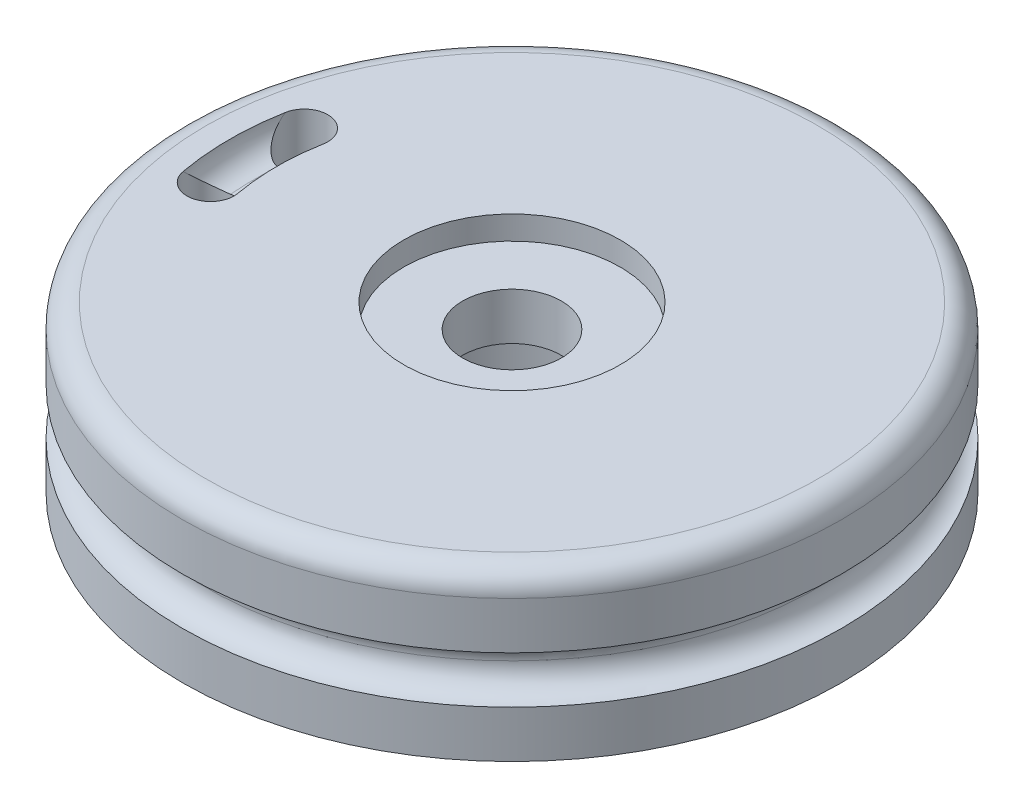
ISO-10303-21;
HEADER;
FILE_DESCRIPTION(('STEP AP214'),'2;1');
FILE_NAME('part.step','',(''),(''),'','','');
FILE_SCHEMA(('AUTOMOTIVE_DESIGN { 1 0 10303 214 1 1 1 1 }'));
ENDSEC;
DATA;
#1=APPLICATION_CONTEXT('core data for automotive mechanical design processes');
#2=APPLICATION_PROTOCOL_DEFINITION('international standard','automotive_design',2000,#1);
#3=PRODUCT_CONTEXT('',#1,'mechanical');
#4=PRODUCT('Part','Part','',(#3));
#5=PRODUCT_RELATED_PRODUCT_CATEGORY('part','',(#4));
#6=PRODUCT_DEFINITION_FORMATION('','',#4);
#7=PRODUCT_DEFINITION_CONTEXT('part definition',#1,'design');
#8=PRODUCT_DEFINITION('design','',#6,#7);
#9=PRODUCT_DEFINITION_SHAPE('','',#8);
#10=(LENGTH_UNIT() NAMED_UNIT(*) SI_UNIT(.MILLI.,.METRE.));
#11=(NAMED_UNIT(*) PLANE_ANGLE_UNIT() SI_UNIT($,.RADIAN.));
#12=(NAMED_UNIT(*) SI_UNIT($,.STERADIAN.) SOLID_ANGLE_UNIT());
#13=UNCERTAINTY_MEASURE_WITH_UNIT(LENGTH_MEASURE(1.E-05),#10,'distance_accuracy_value','');
#14=(GEOMETRIC_REPRESENTATION_CONTEXT(3) GLOBAL_UNCERTAINTY_ASSIGNED_CONTEXT((#13)) GLOBAL_UNIT_ASSIGNED_CONTEXT((#10,
#11,#12)) REPRESENTATION_CONTEXT('',''));
#15=CARTESIAN_POINT('',(0.,0.,0.));
#16=DIRECTION('',(0.,0.,1.));
#17=DIRECTION('',(1.,0.,0.));
#18=AXIS2_PLACEMENT_3D('',#15,#16,#17);
#19=CARTESIAN_POINT('',(0.,3.5,0.));
#20=DIRECTION('',(0.,1.,0.));
#21=DIRECTION('',(-1.,0.,0.));
#22=AXIS2_PLACEMENT_3D('',#19,#20,#21);
#23=PLANE('',#22);
#24=CARTESIAN_POINT('',(0.,3.5,0.));
#25=DIRECTION('',(0.,1.,0.));
#26=DIRECTION('',(-1.,0.,0.));
#27=AXIS2_PLACEMENT_3D('',#24,#25,#26);
#28=CIRCLE('',#27,2.30000000000001);
#29=CARTESIAN_POINT('',(-2.30000000000001,3.5,0.));
#30=VERTEX_POINT('',#29);
#31=EDGE_CURVE('E477',#30,#30,#28,.T.);
#32=ORIENTED_EDGE('',*,*,#31,.F.);
#33=EDGE_LOOP('',(#32));
#34=FACE_BOUND('',#33,.T.);
#35=CARTESIAN_POINT('',(0.,3.5,0.));
#36=DIRECTION('',(0.,1.,0.));
#37=DIRECTION('',(-1.,0.,0.));
#38=AXIS2_PLACEMENT_3D('',#35,#36,#37);
#39=CIRCLE('',#38,6.5);
#40=CARTESIAN_POINT('',(-6.5,3.5,0.));
#41=VERTEX_POINT('',#40);
#42=EDGE_CURVE('E473',#41,#41,#39,.T.);
#43=ORIENTED_EDGE('',*,*,#42,.T.);
#44=EDGE_LOOP('',(#43));
#45=FACE_BOUND('',#44,.T.);
#46=CARTESIAN_POINT('',(-5.40909090909091,3.5,0.995859195463939));
#47=DIRECTION('',(0.,1.,0.));
#48=DIRECTION('',(1.,0.,0.));
#49=AXIS2_PLACEMENT_3D('',#46,#47,#48);
#50=CIRCLE('',#49,0.5);
#51=CARTESIAN_POINT('',(-5.90082644628099,3.5,1.08639184959702));
#52=VERTEX_POINT('',#51);
#53=CARTESIAN_POINT('',(-4.91735537190083,3.5,0.905326541330852));
#54=VERTEX_POINT('',#53);
#55=EDGE_CURVE('E463',#52,#54,#50,.T.);
#56=ORIENTED_EDGE('',*,*,#55,.F.);
#57=CARTESIAN_POINT('',(0.,3.5,0.));
#58=DIRECTION('',(0.,1.,0.));
#59=DIRECTION('',(-1.,0.,0.));
#60=AXIS2_PLACEMENT_3D('',#57,#58,#59);
#61=CIRCLE('',#60,6.);
#62=CARTESIAN_POINT('',(-5.90082644628099,3.5,-1.08639184959702));
#63=VERTEX_POINT('',#62);
#64=EDGE_CURVE('E467',#63,#52,#61,.T.);
#65=ORIENTED_EDGE('',*,*,#64,.F.);
#66=CARTESIAN_POINT('',(-5.40909090909091,3.5,-0.995859195463939));
#67=DIRECTION('',(0.,1.,0.));
#68=DIRECTION('',(-1.,0.,0.));
#69=AXIS2_PLACEMENT_3D('',#66,#67,#68);
#70=CIRCLE('',#69,0.5);
#71=CARTESIAN_POINT('',(-4.91735537190083,3.5,-0.905326541330853));
#72=VERTEX_POINT('',#71);
#73=EDGE_CURVE('E454',#72,#63,#70,.T.);
#74=ORIENTED_EDGE('',*,*,#73,.F.);
#75=CARTESIAN_POINT('',(0.,3.5,0.));
#76=DIRECTION('',(0.,-1.,0.));
#77=DIRECTION('',(-1.,0.,0.));
#78=AXIS2_PLACEMENT_3D('',#75,#76,#77);
#79=CIRCLE('',#78,5.);
#80=EDGE_CURVE('E460',#54,#72,#79,.T.);
#81=ORIENTED_EDGE('',*,*,#80,.F.);
#82=EDGE_LOOP('',(#56,#65,#74,#81));
#83=FACE_BOUND('',#82,.T.);
#84=ADVANCED_FACE('F47',(#34,#45,#83),#23,.T.);
#85=CARTESIAN_POINT('',(0.,3.,0.));
#86=DIRECTION('',(0.,1.,0.));
#87=DIRECTION('',(-1.,0.,0.));
#88=AXIS2_PLACEMENT_3D('',#85,#86,#87);
#89=TOROIDAL_SURFACE('',#88,6.5,0.5);
#90=ORIENTED_EDGE('',*,*,#42,.F.);
#91=EDGE_LOOP('',(#90));
#92=FACE_BOUND('',#91,.T.);
#93=CARTESIAN_POINT('',(0.,3.,0.));
#94=DIRECTION('',(0.,1.,0.));
#95=DIRECTION('',(-1.,0.,0.));
#96=AXIS2_PLACEMENT_3D('',#93,#94,#95);
#97=CIRCLE('',#96,7.);
#98=CARTESIAN_POINT('',(-7.,3.,0.));
#99=VERTEX_POINT('',#98);
#100=EDGE_CURVE('E347',#99,#99,#97,.T.);
#101=ORIENTED_EDGE('',*,*,#100,.T.);
#102=EDGE_LOOP('',(#101));
#103=FACE_BOUND('',#102,.T.);
#104=ADVANCED_FACE('F296',(#92,#103),#89,.T.);
#105=CARTESIAN_POINT('',(0.,3.5,0.));
#106=DIRECTION('',(0.,1.,0.));
#107=DIRECTION('',(-1.,0.,0.));
#108=AXIS2_PLACEMENT_3D('',#105,#106,#107);
#109=CYLINDRICAL_SURFACE('',#108,7.);
#110=ORIENTED_EDGE('',*,*,#100,.F.);
#111=EDGE_LOOP('',(#110));
#112=FACE_BOUND('',#111,.T.);
#113=CARTESIAN_POINT('',(0.,2.,0.));
#114=DIRECTION('',(0.,1.,0.));
#115=DIRECTION('',(-1.,0.,0.));
#116=AXIS2_PLACEMENT_3D('',#113,#114,#115);
#117=CIRCLE('',#116,7.);
#118=CARTESIAN_POINT('',(-6.55978424744938,2.,2.44320089778039));
#119=VERTEX_POINT('',#118);
#120=CARTESIAN_POINT('',(-6.55978424744938,2.,-2.44320089778039));
#121=VERTEX_POINT('',#120);
#122=EDGE_CURVE('E351',#119,#121,#117,.T.);
#123=ORIENTED_EDGE('',*,*,#122,.T.);
#124=EDGE_CURVE('E353',#121,#119,#117,.T.);
#125=ORIENTED_EDGE('',*,*,#124,.T.);
#126=EDGE_LOOP('',(#123,#125));
#127=FACE_BOUND('',#126,.T.);
#128=ADVANCED_FACE('F301',(#112,#127),#109,.T.);
#129=CARTESIAN_POINT('',(0.,2.,0.));
#130=DIRECTION('',(0.,1.,0.));
#131=DIRECTION('',(-1.,0.,0.));
#132=AXIS2_PLACEMENT_3D('',#129,#130,#131);
#133=PLANE('',#132);
#134=CARTESIAN_POINT('',(-5.62267221209947,2.,-2.09417219809748));
#135=DIRECTION('',(0.,1.,0.));
#136=DIRECTION('',(-1.,0.,0.));
#137=AXIS2_PLACEMENT_3D('',#134,#135,#136);
#138=CIRCLE('',#137,1.);
#139=CARTESIAN_POINT('',(-5.89239422562314,2.,-1.13123396777285));
#140=VERTEX_POINT('',#139);
#141=EDGE_CURVE('E360',#121,#140,#138,.T.);
#142=ORIENTED_EDGE('',*,*,#141,.T.);
#143=DIRECTION('',(-0.962938230324635,0.,-0.269722013523666));
#144=VECTOR('',#143,1.);
#145=CARTESIAN_POINT('',(-0.134861006761833,2.,0.481469115162316));
#146=LINE('',#145,#144);
#147=CARTESIAN_POINT('',(-5.89056002425323,2.,-1.13072020222577));
#148=VERTEX_POINT('',#147);
#149=EDGE_CURVE('E367',#140,#148,#146,.F.);
#150=ORIENTED_EDGE('',*,*,#149,.T.);
#151=CARTESIAN_POINT('',(-5.40909090909091,2.,-0.995859195463939));
#152=DIRECTION('',(0.,1.,0.));
#153=DIRECTION('',(-1.,0.,0.));
#154=AXIS2_PLACEMENT_3D('',#151,#152,#153);
#155=CIRCLE('',#154,0.500000000000001);
#156=CARTESIAN_POINT('',(-5.47717837406945,2.,-0.500516791552465));
#157=VERTEX_POINT('',#156);
#158=EDGE_CURVE('E410',#148,#157,#155,.T.);
#159=ORIENTED_EDGE('',*,*,#158,.T.);
#160=CARTESIAN_POINT('',(0.,2.,0.));
#161=DIRECTION('',(0.,1.,0.));
#162=DIRECTION('',(-1.,0.,0.));
#163=AXIS2_PLACEMENT_3D('',#160,#161,#162);
#164=CIRCLE('',#163,5.5);
#165=CARTESIAN_POINT('',(-5.47717837406945,2.,0.500516791552467));
#166=VERTEX_POINT('',#165);
#167=EDGE_CURVE('E413',#157,#166,#164,.T.);
#168=ORIENTED_EDGE('',*,*,#167,.T.);
#169=CARTESIAN_POINT('',(-5.40909090909091,2.,0.995859195463939));
#170=DIRECTION('',(0.,1.,0.));
#171=DIRECTION('',(-1.,0.,0.));
#172=AXIS2_PLACEMENT_3D('',#169,#170,#171);
#173=CIRCLE('',#172,0.5);
#174=CARTESIAN_POINT('',(-5.89056002425322,2.,1.13072020222577));
#175=VERTEX_POINT('',#174);
#176=EDGE_CURVE('E404',#166,#175,#173,.T.);
#177=ORIENTED_EDGE('',*,*,#176,.T.);
#178=DIRECTION('',(0.962938230324635,0.,-0.269722013523666));
#179=VECTOR('',#178,1.);
#180=CARTESIAN_POINT('',(-0.134861006761833,2.,-0.481469115162316));
#181=LINE('',#180,#179);
#182=CARTESIAN_POINT('',(-5.89239422562314,2.,1.13123396777285));
#183=VERTEX_POINT('',#182);
#184=EDGE_CURVE('E368',#175,#183,#181,.F.);
#185=ORIENTED_EDGE('',*,*,#184,.T.);
#186=CARTESIAN_POINT('',(-5.62267221209947,2.,2.09417219809748));
#187=DIRECTION('',(0.,1.,0.));
#188=DIRECTION('',(-1.,0.,0.));
#189=AXIS2_PLACEMENT_3D('',#186,#187,#188);
#190=CIRCLE('',#189,1.);
#191=EDGE_CURVE('E416',#183,#119,#190,.T.);
#192=ORIENTED_EDGE('',*,*,#191,.T.);
#193=ORIENTED_EDGE('',*,*,#124,.F.);
#194=EDGE_LOOP('',(#142,#150,#159,#168,#177,#185,#192,#193));
#195=FACE_BOUND('',#194,.T.);
#196=ADVANCED_FACE('F336',(#195),#133,.F.);
#197=CARTESIAN_POINT('',(0.,1.,0.));
#198=DIRECTION('',(0.,-1.,0.));
#199=DIRECTION('',(1.,0.,0.));
#200=AXIS2_PLACEMENT_3D('',#197,#198,#199);
#201=PLANE('',#200);
#202=CARTESIAN_POINT('',(0.,1.,0.));
#203=DIRECTION('',(0.,1.,0.));
#204=DIRECTION('',(-1.,0.,0.));
#205=AXIS2_PLACEMENT_3D('',#202,#203,#204);
#206=CIRCLE('',#205,7.);
#207=CARTESIAN_POINT('',(-6.55978424744938,0.999999999999999,-2.44320089778039));
#208=VERTEX_POINT('',#207);
#209=CARTESIAN_POINT('',(-6.55978424744938,0.999999999999999,2.44320089778039));
#210=VERTEX_POINT('',#209);
#211=EDGE_CURVE('E167',#208,#210,#206,.T.);
#212=ORIENTED_EDGE('',*,*,#211,.T.);
#213=CARTESIAN_POINT('',(-5.62267221209947,0.999999999999999,2.09417219809748));
#214=DIRECTION('',(0.,-1.,0.));
#215=DIRECTION('',(1.,0.,0.));
#216=AXIS2_PLACEMENT_3D('',#213,#214,#215);
#217=CIRCLE('',#216,1.);
#218=CARTESIAN_POINT('',(-5.89239422562314,0.999999999999999,1.13123396777285));
#219=VERTEX_POINT('',#218);
#220=EDGE_CURVE('E161',#210,#219,#217,.T.);
#221=ORIENTED_EDGE('',*,*,#220,.T.);
#222=DIRECTION('',(0.962938230324635,0.,-0.269722013523666));
#223=VECTOR('',#222,1.);
#224=CARTESIAN_POINT('',(-0.134861006761833,1.,-0.481469115162317));
#225=LINE('',#224,#223);
#226=CARTESIAN_POINT('',(-5.40909090909091,0.999999999999999,0.995859195463939));
#227=VERTEX_POINT('',#226);
#228=EDGE_CURVE('E165',#219,#227,#225,.T.);
#229=ORIENTED_EDGE('',*,*,#228,.T.);
#230=CARTESIAN_POINT('',(0.,1.,0.));
#231=DIRECTION('',(0.,-1.,0.));
#232=DIRECTION('',(1.,0.,0.));
#233=AXIS2_PLACEMENT_3D('',#230,#231,#232);
#234=CIRCLE('',#233,5.5);
#235=CARTESIAN_POINT('',(-5.40909090909091,0.999999999999999,-0.995859195463938));
#236=VERTEX_POINT('',#235);
#237=EDGE_CURVE('E427',#227,#236,#234,.T.);
#238=ORIENTED_EDGE('',*,*,#237,.T.);
#239=DIRECTION('',(-0.962938230324635,0.,-0.269722013523666));
#240=VECTOR('',#239,1.);
#241=CARTESIAN_POINT('',(-0.134861006761833,1.,0.481469115162316));
#242=LINE('',#241,#240);
#243=CARTESIAN_POINT('',(-5.89239422562314,0.999999999999999,-1.13123396777285));
#244=VERTEX_POINT('',#243);
#245=EDGE_CURVE('E192',#236,#244,#242,.T.);
#246=ORIENTED_EDGE('',*,*,#245,.T.);
#247=CARTESIAN_POINT('',(-5.62267221209947,0.999999999999999,-2.09417219809748));
#248=DIRECTION('',(0.,-1.,0.));
#249=DIRECTION('',(1.,0.,0.));
#250=AXIS2_PLACEMENT_3D('',#247,#248,#249);
#251=CIRCLE('',#250,1.);
#252=EDGE_CURVE('E189',#244,#208,#251,.T.);
#253=ORIENTED_EDGE('',*,*,#252,.T.);
#254=EDGE_LOOP('',(#212,#221,#229,#238,#246,#253));
#255=FACE_BOUND('',#254,.T.);
#256=ADVANCED_FACE('F163',(#255),#201,.F.);
#257=CARTESIAN_POINT('',(0.,3.5,0.));
#258=DIRECTION('',(0.,1.,0.));
#259=DIRECTION('',(-1.,0.,0.));
#260=AXIS2_PLACEMENT_3D('',#257,#258,#259);
#261=CYLINDRICAL_SURFACE('',#260,7.);
#262=EDGE_CURVE('E435',#210,#208,#206,.T.);
#263=ORIENTED_EDGE('',*,*,#262,.F.);
#264=ORIENTED_EDGE('',*,*,#211,.F.);
#265=EDGE_LOOP('',(#263,#264));
#266=FACE_BOUND('',#265,.T.);
#267=CARTESIAN_POINT('',(0.,0.,0.));
#268=DIRECTION('',(0.,1.,0.));
#269=DIRECTION('',(-1.,0.,0.));
#270=AXIS2_PLACEMENT_3D('',#267,#268,#269);
#271=CIRCLE('',#270,7.);
#272=CARTESIAN_POINT('',(-7.,0.,0.));
#273=VERTEX_POINT('',#272);
#274=EDGE_CURVE('E440',#273,#273,#271,.T.);
#275=ORIENTED_EDGE('',*,*,#274,.T.);
#276=EDGE_LOOP('',(#275));
#277=FACE_BOUND('',#276,.T.);
#278=ADVANCED_FACE('F329',(#266,#277),#261,.T.);
#279=CARTESIAN_POINT('',(0.,0.,0.));
#280=DIRECTION('',(0.,-1.,0.));
#281=DIRECTION('',(1.,0.,0.));
#282=AXIS2_PLACEMENT_3D('',#279,#280,#281);
#283=PLANE('',#282);
#284=CARTESIAN_POINT('',(0.,0.,0.));
#285=DIRECTION('',(0.,1.,0.));
#286=DIRECTION('',(-1.,0.,0.));
#287=AXIS2_PLACEMENT_3D('',#284,#285,#286);
#288=CIRCLE('',#287,2.35);
#289=CARTESIAN_POINT('',(-2.35,0.,0.));
#290=VERTEX_POINT('',#289);
#291=EDGE_CURVE('E496',#290,#290,#288,.T.);
#292=ORIENTED_EDGE('',*,*,#291,.T.);
#293=EDGE_LOOP('',(#292));
#294=FACE_BOUND('',#293,.T.);
#295=ORIENTED_EDGE('',*,*,#274,.F.);
#296=EDGE_LOOP('',(#295));
#297=FACE_BOUND('',#296,.T.);
#298=ADVANCED_FACE('F325',(#294,#297),#283,.T.);
#299=CARTESIAN_POINT('',(0.,3.5,0.));
#300=DIRECTION('',(0.,1.,0.));
#301=DIRECTION('',(-1.,0.,0.));
#302=AXIS2_PLACEMENT_3D('',#299,#300,#301);
#303=CYLINDRICAL_SURFACE('',#302,2.35);
#304=CARTESIAN_POINT('',(0.,2.,0.));
#305=DIRECTION('',(0.,1.,0.));
#306=DIRECTION('',(-1.,0.,0.));
#307=AXIS2_PLACEMENT_3D('',#304,#305,#306);
#308=CIRCLE('',#307,2.35);
#309=CARTESIAN_POINT('',(-2.35,2.,0.));
#310=VERTEX_POINT('',#309);
#311=EDGE_CURVE('E493',#310,#310,#308,.T.);
#312=ORIENTED_EDGE('',*,*,#311,.T.);
#313=EDGE_LOOP('',(#312));
#314=FACE_BOUND('',#313,.T.);
#315=ORIENTED_EDGE('',*,*,#291,.F.);
#316=EDGE_LOOP('',(#315));
#317=FACE_BOUND('',#316,.T.);
#318=ADVANCED_FACE('F321',(#314,#317),#303,.F.);
#319=CARTESIAN_POINT('',(0.,2.,0.));
#320=DIRECTION('',(0.,-1.,0.));
#321=DIRECTION('',(1.,0.,0.));
#322=AXIS2_PLACEMENT_3D('',#319,#320,#321);
#323=PLANE('',#322);
#324=CARTESIAN_POINT('',(0.,2.,0.));
#325=DIRECTION('',(0.,1.,0.));
#326=DIRECTION('',(-1.,0.,0.));
#327=AXIS2_PLACEMENT_3D('',#324,#325,#326);
#328=CIRCLE('',#327,1.05000000000001);
#329=CARTESIAN_POINT('',(-1.05000000000001,2.,0.));
#330=VERTEX_POINT('',#329);
#331=EDGE_CURVE('E489',#330,#330,#328,.T.);
#332=ORIENTED_EDGE('',*,*,#331,.T.);
#333=EDGE_LOOP('',(#332));
#334=FACE_BOUND('',#333,.T.);
#335=ORIENTED_EDGE('',*,*,#311,.F.);
#336=EDGE_LOOP('',(#335));
#337=FACE_BOUND('',#336,.T.);
#338=ADVANCED_FACE('F317',(#334,#337),#323,.T.);
#339=CARTESIAN_POINT('',(0.,3.5,0.));
#340=DIRECTION('',(0.,1.,0.));
#341=DIRECTION('',(-1.,0.,0.));
#342=AXIS2_PLACEMENT_3D('',#339,#340,#341);
#343=CYLINDRICAL_SURFACE('',#342,1.05000000000001);
#344=CARTESIAN_POINT('',(0.,3.,0.));
#345=DIRECTION('',(0.,1.,0.));
#346=DIRECTION('',(-1.,0.,0.));
#347=AXIS2_PLACEMENT_3D('',#344,#345,#346);
#348=CIRCLE('',#347,1.05000000000001);
#349=CARTESIAN_POINT('',(-1.05000000000001,3.,0.));
#350=VERTEX_POINT('',#349);
#351=EDGE_CURVE('E485',#350,#350,#348,.T.);
#352=ORIENTED_EDGE('',*,*,#351,.T.);
#353=EDGE_LOOP('',(#352));
#354=FACE_BOUND('',#353,.T.);
#355=ORIENTED_EDGE('',*,*,#331,.F.);
#356=EDGE_LOOP('',(#355));
#357=FACE_BOUND('',#356,.T.);
#358=ADVANCED_FACE('F313',(#354,#357),#343,.F.);
#359=CARTESIAN_POINT('',(0.,3.,0.));
#360=DIRECTION('',(0.,1.,0.));
#361=DIRECTION('',(-1.,0.,0.));
#362=AXIS2_PLACEMENT_3D('',#359,#360,#361);
#363=PLANE('',#362);
#364=CARTESIAN_POINT('',(0.,3.,0.));
#365=DIRECTION('',(0.,1.,0.));
#366=DIRECTION('',(-1.,0.,0.));
#367=AXIS2_PLACEMENT_3D('',#364,#365,#366);
#368=CIRCLE('',#367,2.30000000000001);
#369=CARTESIAN_POINT('',(-2.30000000000001,3.,0.));
#370=VERTEX_POINT('',#369);
#371=EDGE_CURVE('E481',#370,#370,#368,.T.);
#372=ORIENTED_EDGE('',*,*,#371,.T.);
#373=EDGE_LOOP('',(#372));
#374=FACE_BOUND('',#373,.T.);
#375=ORIENTED_EDGE('',*,*,#351,.F.);
#376=EDGE_LOOP('',(#375));
#377=FACE_BOUND('',#376,.T.);
#378=ADVANCED_FACE('F309',(#374,#377),#363,.T.);
#379=CARTESIAN_POINT('',(0.,3.5,0.));
#380=DIRECTION('',(0.,1.,0.));
#381=DIRECTION('',(-1.,0.,0.));
#382=AXIS2_PLACEMENT_3D('',#379,#380,#381);
#383=CYLINDRICAL_SURFACE('',#382,2.30000000000001);
#384=ORIENTED_EDGE('',*,*,#31,.T.);
#385=EDGE_LOOP('',(#384));
#386=FACE_BOUND('',#385,.T.);
#387=ORIENTED_EDGE('',*,*,#371,.F.);
#388=EDGE_LOOP('',(#387));
#389=FACE_BOUND('',#388,.T.);
#390=ADVANCED_FACE('F306',(#386,#389),#383,.F.);
#391=CARTESIAN_POINT('',(-5.40909090909091,3.,0.995859195463939));
#392=DIRECTION('',(0.,1.,0.));
#393=DIRECTION('',(-1.,0.,0.));
#394=AXIS2_PLACEMENT_3D('',#391,#392,#393);
#395=CYLINDRICAL_SURFACE('',#394,0.5);
#396=ORIENTED_EDGE('',*,*,#55,.T.);
#397=CARTESIAN_POINT('',(-5.47717837406945,3.,0.500516791552466));
#398=CARTESIAN_POINT('',(-5.45517486032023,2.99995984885113,0.497453520547869));
#399=CARTESIAN_POINT('',(-5.43300856139952,3.00147448953539,0.495937294202887));
#400=CARTESIAN_POINT('',(-5.38922722052391,3.00733161658892,0.495789205108272));
#401=CARTESIAN_POINT('',(-5.36760909260325,3.01164992740612,0.497132905333294));
#402=CARTESIAN_POINT('',(-5.3254520077055,3.02282789613908,0.502443967965517));
#403=CARTESIAN_POINT('',(-5.30491066596293,3.02968164156852,0.506405243104695));
#404=CARTESIAN_POINT('',(-5.26522940210346,3.04552685091784,0.516563802483401));
#405=CARTESIAN_POINT('',(-5.24609255624634,3.05452283431043,0.522765828532039));
#406=CARTESIAN_POINT('',(-5.20203402266097,3.07824508833625,0.53990842921551));
#407=CARTESIAN_POINT('',(-5.17791851089022,3.09381493222312,0.551750525793056));
#408=CARTESIAN_POINT('',(-5.133092436141,3.12738196018618,0.578122334985739));
#409=CARTESIAN_POINT('',(-5.11238917949768,3.14538420641551,0.592657676675903));
#410=CARTESIAN_POINT('',(-5.06612710451075,3.19113858138495,0.630335136150353));
#411=CARTESIAN_POINT('',(-5.04227606998681,3.2197688115607,0.654500259816));
#412=CARTESIAN_POINT('',(-5.00073435873925,3.2790257617952,0.705467135179171));
#413=CARTESIAN_POINT('',(-4.98305054511758,3.30965466135027,0.732271781979811));
#414=CARTESIAN_POINT('',(-4.95607499535473,3.36635692421274,0.782694493849123));
#415=CARTESIAN_POINT('',(-4.94584547375332,3.39225737345733,0.806017139499245));
#416=CARTESIAN_POINT('',(-4.92910993409329,3.4443645189007,0.853550770320342));
#417=CARTESIAN_POINT('',(-4.92259687557884,3.47057053943004,0.877759982728227));
#418=CARTESIAN_POINT('',(-4.91773101484498,3.4978422317036,0.903303771667612));
#419=CARTESIAN_POINT('',(-4.91754163285731,3.49892113375188,0.904314886542298));
#420=CARTESIAN_POINT('',(-4.91735537190083,3.5,0.905326541330854));
#421=B_SPLINE_CURVE_WITH_KNOTS('',3,(#397,#398,#399,#400,#401,#402,#403,#404,#405,#406,#407,
#408,#409,#410,#411,#412,#413,#414,#415,#416,#417,#418,#419,#420),.UNSPECIFIED.,.F.,.F.,(4,2,2,
2,2,2,2,2,2,2,2,4),(0.,0.0664643606886865,0.132363088825389,0.198109103822023,0.263995071368777,
0.356633312558987,0.44946740423259,0.581987252725834,0.714654106920854,0.823429978519499,
0.931999095436568,0.936471241532681),.UNSPECIFIED.);
#422=CARTESIAN_POINT('',(-5.47717837406945,3.,0.500516791552466));
#423=VERTEX_POINT('',#422);
#424=EDGE_CURVE('E245',#54,#423,#421,.F.);
#425=ORIENTED_EDGE('',*,*,#424,.T.);
#426=CARTESIAN_POINT('',(-5.47717837406945,3.,0.500516791552466));
#427=CARTESIAN_POINT('',(-5.49965263947496,2.99996544029707,0.503568383809631));
#428=CARTESIAN_POINT('',(-5.52184387568958,3.00153773306245,0.508211295918511));
#429=CARTESIAN_POINT('',(-5.56486862581549,3.00752303107547,0.520235849337537));
#430=CARTESIAN_POINT('',(-5.58571231080021,3.01191108923295,0.527593200319978));
#431=CARTESIAN_POINT('',(-5.62560229339923,3.02314920384038,0.544643492180817));
#432=CARTESIAN_POINT('',(-5.64465394257411,3.02999161581348,0.554329150616324));
#433=CARTESIAN_POINT('',(-5.68079159325296,3.04571046281115,0.575598358833039));
#434=CARTESIAN_POINT('',(-5.69787285190448,3.05459165789173,0.587186331722742));
#435=CARTESIAN_POINT('',(-5.73640252191927,3.07790124253157,0.616816583712409));
#436=CARTESIAN_POINT('',(-5.75682280962186,3.09312036404839,0.635573665335923));
#437=CARTESIAN_POINT('',(-5.79353310146023,3.12583405137258,0.675027183504377));
#438=CARTESIAN_POINT('',(-5.80981595198853,3.1433324801554,0.695726895387368));
#439=CARTESIAN_POINT('',(-5.84345324446028,3.18630963551845,0.745801464250067));
#440=CARTESIAN_POINT('',(-5.85920560588166,3.21244511643028,0.775686734545558));
#441=CARTESIAN_POINT('',(-5.88416862837053,3.26650553985183,0.836533306168532));
#442=CARTESIAN_POINT('',(-5.89337066306017,3.29443278947364,0.867495970313995));
#443=CARTESIAN_POINT('',(-5.9056792431917,3.35122045745563,0.929548832611454));
#444=CARTESIAN_POINT('',(-5.90880558310253,3.38007753301093,0.960638284798905));
#445=CARTESIAN_POINT('',(-5.90933815440017,3.43822268564596,1.02235264199674));
#446=CARTESIAN_POINT('',(-5.9067569444462,3.46750967587562,1.05297841793776));
#447=CARTESIAN_POINT('',(-5.90122997245665,3.49784651242178,1.08417909534778));
#448=CARTESIAN_POINT('',(-5.90103006885849,3.49892328127894,1.08528584145894));
#449=CARTESIAN_POINT('',(-5.90082644628099,3.5,1.08639184959702));
#450=B_SPLINE_CURVE_WITH_KNOTS('',3,(#426,#427,#428,#429,#430,#431,#432,#433,#434,#435,#436,
#437,#438,#439,#440,#441,#442,#443,#444,#445,#446,#447,#448,#449),.UNSPECIFIED.,.F.,.F.,(4,2,2,
2,2,2,2,2,2,2,2,4),(0.,0.0678325924069058,0.135072347835983,0.202104467366868,0.269294711409754,
0.363661966873367,0.458191289327025,0.585645139421967,0.713266529424101,0.840471430288526,
0.967396713276765,0.972067720812914),.UNSPECIFIED.);
#451=EDGE_CURVE('E445',#423,#52,#450,.T.);
#452=ORIENTED_EDGE('',*,*,#451,.T.);
#453=EDGE_LOOP('',(#396,#425,#452));
#454=FACE_BOUND('',#453,.T.);
#455=ORIENTED_EDGE('',*,*,#176,.F.);
#456=CARTESIAN_POINT('',(-5.47717837406945,2.,0.500516791552466));
#457=CARTESIAN_POINT('',(-5.45517486032023,2.00004015114887,0.497453520547869));
#458=CARTESIAN_POINT('',(-5.43300856139952,1.99852551046461,0.495937294202887));
#459=CARTESIAN_POINT('',(-5.38922722052391,1.99266838341107,0.495789205108272));
#460=CARTESIAN_POINT('',(-5.36760909260325,1.98835007259388,0.497132905333294));
#461=CARTESIAN_POINT('',(-5.3254520077055,1.97717210386092,0.502443967965517));
#462=CARTESIAN_POINT('',(-5.30491066596293,1.97031835843147,0.506405243104695));
#463=CARTESIAN_POINT('',(-5.26522940210346,1.95447314908216,0.516563802483401));
#464=CARTESIAN_POINT('',(-5.24609255624634,1.94547716568957,0.522765828532039));
#465=CARTESIAN_POINT('',(-5.20203402266097,1.92175491166375,0.53990842921551));
#466=CARTESIAN_POINT('',(-5.17791851089022,1.90618506777688,0.551750525793056));
#467=CARTESIAN_POINT('',(-5.133092436141,1.87261803981382,0.578122334985738));
#468=CARTESIAN_POINT('',(-5.11238917949769,1.85461579358449,0.592657676675901));
#469=CARTESIAN_POINT('',(-5.06612710451075,1.80886141861505,0.630335136150355));
#470=CARTESIAN_POINT('',(-5.04227606998681,1.78023118843931,0.65450025981601));
#471=CARTESIAN_POINT('',(-5.00073435873925,1.72097423820479,0.705467135179162));
#472=CARTESIAN_POINT('',(-4.98305054511758,1.69034533864969,0.732271781979773));
#473=CARTESIAN_POINT('',(-4.95607499535473,1.63364307578729,0.782694493849152));
#474=CARTESIAN_POINT('',(-4.9458454737533,1.60774262654276,0.806017139499347));
#475=CARTESIAN_POINT('',(-4.92910993409331,1.5556354810992,0.853550770320238));
#476=CARTESIAN_POINT('',(-4.92259687557891,1.52942946056959,0.877759982727845));
#477=CARTESIAN_POINT('',(-4.91773101484498,1.50215776829637,0.903303771667581));
#478=CARTESIAN_POINT('',(-4.91754163285731,1.50107886624811,0.904314886542282));
#479=CARTESIAN_POINT('',(-4.91735537190083,1.5,0.905326541330854));
#480=B_SPLINE_CURVE_WITH_KNOTS('',3,(#456,#457,#458,#459,#460,#461,#462,#463,#464,#465,#466,
#467,#468,#469,#470,#471,#472,#473,#474,#475,#476,#477,#478,#479),.UNSPECIFIED.,.F.,.F.,(4,2,2,
2,2,2,2,2,2,2,2,4),(0.,0.0664643606886856,0.132363088825389,0.198109103822023,0.263995071368777,
0.356633312558986,0.44946740423259,0.581987252725835,0.714654106920852,0.823429978519498,
0.931999095436568,0.936471241532681),.UNSPECIFIED.);
#481=CARTESIAN_POINT('',(-4.91735537190082,1.5,0.905326541330853));
#482=VERTEX_POINT('',#481);
#483=EDGE_CURVE('E11',#166,#482,#480,.T.);
#484=ORIENTED_EDGE('',*,*,#483,.T.);
#485=CARTESIAN_POINT('',(-5.40909090909091,1.5,0.995859195463939));
#486=DIRECTION('',(0.,1.,0.));
#487=DIRECTION('',(-1.,0.,0.));
#488=AXIS2_PLACEMENT_3D('',#485,#486,#487);
#489=CIRCLE('',#488,0.5);
#490=CARTESIAN_POINT('',(-5.27422990232907,1.5,1.47732831062626));
#491=VERTEX_POINT('',#490);
#492=EDGE_CURVE('E424',#482,#491,#489,.F.);
#493=ORIENTED_EDGE('',*,*,#492,.T.);
#494=CARTESIAN_POINT('',(-5.40909090909091,1.5,0.995859195463938));
#495=DIRECTION('',(0.680900152526323,0.707106781186548,-0.190722264797874));
#496=DIRECTION('',(-0.680900152526323,0.707106781186547,0.190722264797874));
#497=AXIS2_PLACEMENT_3D('',#494,#495,#496);
#498=ELLIPSE('',#497,0.707106781186548,0.5);
#499=EDGE_CURVE('E198',#491,#175,#498,.F.);
#500=ORIENTED_EDGE('',*,*,#499,.T.);
#501=EDGE_LOOP('',(#455,#484,#493,#500));
#502=FACE_BOUND('',#501,.T.);
#503=ADVANCED_FACE('F224',(#454,#502),#395,.F.);
#504=CARTESIAN_POINT('',(-5.40909090909091,3.,-0.995859195463939));
#505=DIRECTION('',(0.,1.,0.));
#506=DIRECTION('',(-1.,0.,0.));
#507=AXIS2_PLACEMENT_3D('',#504,#505,#506);
#508=CYLINDRICAL_SURFACE('',#507,0.5);
#509=ORIENTED_EDGE('',*,*,#73,.T.);
#510=CARTESIAN_POINT('',(-5.47717837406945,3.,-0.500516791552465));
#511=CARTESIAN_POINT('',(-5.49965263947496,2.99996544029707,-0.50356838380963));
#512=CARTESIAN_POINT('',(-5.52184387568958,3.00153773306245,-0.508211295918511));
#513=CARTESIAN_POINT('',(-5.56486862581549,3.00752303107547,-0.520235849337536));
#514=CARTESIAN_POINT('',(-5.58571231080021,3.01191108923295,-0.527593200319977));
#515=CARTESIAN_POINT('',(-5.62560229339923,3.02314920384038,-0.544643492180816));
#516=CARTESIAN_POINT('',(-5.64465394257411,3.02999161581348,-0.554329150616322));
#517=CARTESIAN_POINT('',(-5.68079159325296,3.04571046281115,-0.575598358833037));
#518=CARTESIAN_POINT('',(-5.69787285190448,3.05459165789173,-0.587186331722739));
#519=CARTESIAN_POINT('',(-5.73640252191927,3.07790124253157,-0.616816583712408));
#520=CARTESIAN_POINT('',(-5.75682280962186,3.09312036404839,-0.635573665335924));
#521=CARTESIAN_POINT('',(-5.79353310146024,3.12583405137258,-0.675027183504375));
#522=CARTESIAN_POINT('',(-5.80981595198853,3.14333248015541,-0.695726895387359));
#523=CARTESIAN_POINT('',(-5.84345324446028,3.18630963551844,-0.745801464250074));
#524=CARTESIAN_POINT('',(-5.85920560588165,3.21244511643023,-0.775686734545597));
#525=CARTESIAN_POINT('',(-5.88416862837054,3.26650553985188,-0.836533306168479));
#526=CARTESIAN_POINT('',(-5.8933706630602,3.29443278947382,-0.867495970313817));
#527=CARTESIAN_POINT('',(-5.90567924319167,3.35122045745546,-0.929548832611624));
#528=CARTESIAN_POINT('',(-5.90880558310241,3.38007753301025,-0.960638284799547));
#529=CARTESIAN_POINT('',(-5.9093381544003,3.43822268564666,-1.02235264199609));
#530=CARTESIAN_POINT('',(-5.90675694444665,3.46750967587818,-1.05297841793534));
#531=CARTESIAN_POINT('',(-5.90122997245669,3.49784651242197,-1.0841790953476));
#532=CARTESIAN_POINT('',(-5.9010300688585,3.49892328127904,-1.08528584145885));
#533=CARTESIAN_POINT('',(-5.90082644628099,3.5,-1.08639184959702));
#534=B_SPLINE_CURVE_WITH_KNOTS('',3,(#510,#511,#512,#513,#514,#515,#516,#517,#518,#519,#520,
#521,#522,#523,#524,#525,#526,#527,#528,#529,#530,#531,#532,#533),.UNSPECIFIED.,.F.,.F.,(4,2,2,
2,2,2,2,2,2,2,2,4),(0.,0.0678325924069068,0.135072347835983,0.202104467366867,0.269294711409754,
0.363661966873371,0.458191289327026,0.58564513942196,0.713266529424103,0.840471430288532,
0.967396713276766,0.972067720812916),.UNSPECIFIED.);
#535=CARTESIAN_POINT('',(-5.47717837406945,3.,-0.500516791552465));
#536=VERTEX_POINT('',#535);
#537=EDGE_CURVE('E230',#63,#536,#534,.F.);
#538=ORIENTED_EDGE('',*,*,#537,.T.);
#539=CARTESIAN_POINT('',(-5.47717837406945,3.,-0.500516791552465));
#540=CARTESIAN_POINT('',(-5.45517486032023,2.99995984885113,-0.497453520547869));
#541=CARTESIAN_POINT('',(-5.43300856139952,3.00147448953539,-0.495937294202887));
#542=CARTESIAN_POINT('',(-5.38922722052391,3.00733161658892,-0.495789205108273));
#543=CARTESIAN_POINT('',(-5.36760909260325,3.01164992740612,-0.497132905333295));
#544=CARTESIAN_POINT('',(-5.3254520077055,3.02282789613908,-0.502443967965518));
#545=CARTESIAN_POINT('',(-5.30491066596293,3.02968164156853,-0.506405243104695));
#546=CARTESIAN_POINT('',(-5.26522940210346,3.04552685091784,-0.516563802483402));
#547=CARTESIAN_POINT('',(-5.24609255624634,3.05452283431043,-0.522765828532041));
#548=CARTESIAN_POINT('',(-5.20203402266097,3.07824508833626,-0.539908429215512));
#549=CARTESIAN_POINT('',(-5.17791851089021,3.09381493222313,-0.551750525793057));
#550=CARTESIAN_POINT('',(-5.133092436141,3.12738196018618,-0.578122334985745));
#551=CARTESIAN_POINT('',(-5.11238917949768,3.14538420641551,-0.592657676675914));
#552=CARTESIAN_POINT('',(-5.06612710451075,3.19113858138496,-0.630335136150345));
#553=CARTESIAN_POINT('',(-5.04227606998682,3.21976881156074,-0.654500259815954));
#554=CARTESIAN_POINT('',(-5.00073435873924,3.27902576179515,-0.705467135179224));
#555=CARTESIAN_POINT('',(-4.98305054511754,3.30965466135009,-0.732271781980002));
#556=CARTESIAN_POINT('',(-4.95607499535476,3.36635692421288,-0.78269449384898));
#557=CARTESIAN_POINT('',(-4.94584547375341,3.39225737345783,-0.806017139498735));
#558=CARTESIAN_POINT('',(-4.9291099340932,3.44436451890018,-0.853550770320874));
#559=CARTESIAN_POINT('',(-4.9225968755785,3.47057053942816,-0.877759982730165));
#560=CARTESIAN_POINT('',(-4.91773101484495,3.49784223170344,-0.903303771667769));
#561=CARTESIAN_POINT('',(-4.9175416328573,3.4989211337518,-0.904314886542379));
#562=CARTESIAN_POINT('',(-4.91735537190083,3.5,-0.905326541330853));
#563=B_SPLINE_CURVE_WITH_KNOTS('',3,(#539,#540,#541,#542,#543,#544,#545,#546,#547,#548,#549,
#550,#551,#552,#553,#554,#555,#556,#557,#558,#559,#560,#561,#562),.UNSPECIFIED.,.F.,.F.,(4,2,2,
2,2,2,2,2,2,2,2,4),(0.,0.0664643606886881,0.132363088825391,0.198109103822024,0.263995071368779,
0.356633312558992,0.449467404232593,0.581987252725832,0.714654106920859,0.823429978519502,
0.931999095436567,0.93647124153268),.UNSPECIFIED.);
#564=EDGE_CURVE('E98',#536,#72,#563,.T.);
#565=ORIENTED_EDGE('',*,*,#564,.T.);
#566=EDGE_LOOP('',(#509,#538,#565));
#567=FACE_BOUND('',#566,.T.);
#568=ORIENTED_EDGE('',*,*,#158,.F.);
#569=CARTESIAN_POINT('',(-5.40909090909091,1.5,-0.995859195463939));
#570=DIRECTION('',(0.680900152526323,0.707106781186548,0.190722264797874));
#571=DIRECTION('',(-0.680900152526323,0.707106781186547,-0.190722264797874));
#572=AXIS2_PLACEMENT_3D('',#569,#570,#571);
#573=ELLIPSE('',#572,0.707106781186548,0.5);
#574=CARTESIAN_POINT('',(-5.27422990232908,1.5,-1.47732831062626));
#575=VERTEX_POINT('',#574);
#576=EDGE_CURVE('E67',#148,#575,#573,.F.);
#577=ORIENTED_EDGE('',*,*,#576,.T.);
#578=CARTESIAN_POINT('',(-5.40909090909091,1.5,-0.995859195463939));
#579=DIRECTION('',(0.,1.,0.));
#580=DIRECTION('',(-1.,0.,0.));
#581=AXIS2_PLACEMENT_3D('',#578,#579,#580);
#582=CIRCLE('',#581,0.5);
#583=CARTESIAN_POINT('',(-4.91735537190083,1.5,-0.905326541330853));
#584=VERTEX_POINT('',#583);
#585=EDGE_CURVE('E172',#575,#584,#582,.F.);
#586=ORIENTED_EDGE('',*,*,#585,.T.);
#587=CARTESIAN_POINT('',(-5.47717837406945,2.,-0.500516791552465));
#588=CARTESIAN_POINT('',(-5.45517486032023,2.00004015114887,-0.497453520547869));
#589=CARTESIAN_POINT('',(-5.43300856139952,1.99852551046461,-0.495937294202886));
#590=CARTESIAN_POINT('',(-5.38922722052391,1.99266838341107,-0.495789205108273));
#591=CARTESIAN_POINT('',(-5.36760909260325,1.98835007259388,-0.497132905333295));
#592=CARTESIAN_POINT('',(-5.3254520077055,1.97717210386092,-0.502443967965518));
#593=CARTESIAN_POINT('',(-5.30491066596293,1.97031835843147,-0.506405243104695));
#594=CARTESIAN_POINT('',(-5.26522940210346,1.95447314908216,-0.516563802483402));
#595=CARTESIAN_POINT('',(-5.24609255624634,1.94547716568957,-0.522765828532041));
#596=CARTESIAN_POINT('',(-5.20203402266097,1.92175491166374,-0.539908429215512));
#597=CARTESIAN_POINT('',(-5.17791851089022,1.90618506777687,-0.551750525793056));
#598=CARTESIAN_POINT('',(-5.133092436141,1.87261803981382,-0.578122334985744));
#599=CARTESIAN_POINT('',(-5.11238917949768,1.85461579358449,-0.592657676675913));
#600=CARTESIAN_POINT('',(-5.06612710451075,1.80886141861504,-0.630335136150344));
#601=CARTESIAN_POINT('',(-5.04227606998682,1.78023118843926,-0.654500259815951));
#602=CARTESIAN_POINT('',(-5.00073435873924,1.72097423820485,-0.705467135179225));
#603=CARTESIAN_POINT('',(-4.98305054511754,1.69034533864992,-0.732271781980008));
#604=CARTESIAN_POINT('',(-4.95607499535476,1.63364307578711,-0.782694493848974));
#605=CARTESIAN_POINT('',(-4.94584547375341,1.60774262654215,-0.806017139498715));
#606=CARTESIAN_POINT('',(-4.92910993409319,1.55563548109983,-0.853550770320892));
#607=CARTESIAN_POINT('',(-4.92259687557848,1.5294294605719,-0.877759982730235));
#608=CARTESIAN_POINT('',(-4.91773101484495,1.50215776829656,-0.903303771667774));
#609=CARTESIAN_POINT('',(-4.91754163285729,1.50107886624821,-0.904314886542382));
#610=CARTESIAN_POINT('',(-4.91735537190083,1.5,-0.905326541330853));
#611=B_SPLINE_CURVE_WITH_KNOTS('',3,(#587,#588,#589,#590,#591,#592,#593,#594,#595,#596,#597,
#598,#599,#600,#601,#602,#603,#604,#605,#606,#607,#608,#609,#610),.UNSPECIFIED.,.F.,.F.,(4,2,2,
2,2,2,2,2,2,2,2,4),(0.,0.0664643606886873,0.13236308882539,0.198109103822024,0.263995071368778,
0.356633312558991,0.449467404232592,0.58198725272583,0.714654106920858,0.823429978519503,
0.931999095436567,0.93647124153268),.UNSPECIFIED.);
#612=EDGE_CURVE('E58',#584,#157,#611,.F.);
#613=ORIENTED_EDGE('',*,*,#612,.T.);
#614=EDGE_LOOP('',(#568,#577,#586,#613));
#615=FACE_BOUND('',#614,.T.);
#616=ADVANCED_FACE('F220',(#567,#615),#508,.F.);
#617=CARTESIAN_POINT('',(0.,3.5,0.));
#618=DIRECTION('',(0.,-1.,0.));
#619=DIRECTION('',(1.,0.,0.));
#620=AXIS2_PLACEMENT_3D('',#617,#618,#619);
#621=TOROIDAL_SURFACE('',#620,5.5,0.5);
#622=ORIENTED_EDGE('',*,*,#80,.T.);
#623=ORIENTED_EDGE('',*,*,#564,.F.);
#624=CARTESIAN_POINT('',(0.,3.,0.));
#625=DIRECTION('',(0.,-1.,0.));
#626=DIRECTION('',(1.,0.,0.));
#627=AXIS2_PLACEMENT_3D('',#624,#625,#626);
#628=CIRCLE('',#627,5.5);
#629=EDGE_CURVE('E400',#423,#536,#628,.T.);
#630=ORIENTED_EDGE('',*,*,#629,.F.);
#631=ORIENTED_EDGE('',*,*,#424,.F.);
#632=EDGE_LOOP('',(#622,#623,#630,#631));
#633=FACE_BOUND('',#632,.T.);
#634=ADVANCED_FACE('F223',(#633),#621,.F.);
#635=CARTESIAN_POINT('',(0.,3.5,0.));
#636=DIRECTION('',(0.,-1.,0.));
#637=DIRECTION('',(1.,0.,0.));
#638=AXIS2_PLACEMENT_3D('',#635,#636,#637);
#639=TOROIDAL_SURFACE('',#638,5.5,0.5);
#640=ORIENTED_EDGE('',*,*,#537,.F.);
#641=ORIENTED_EDGE('',*,*,#64,.T.);
#642=ORIENTED_EDGE('',*,*,#451,.F.);
#643=ORIENTED_EDGE('',*,*,#629,.T.);
#644=EDGE_LOOP('',(#640,#641,#642,#643));
#645=FACE_BOUND('',#644,.T.);
#646=ADVANCED_FACE('F254',(#645),#639,.F.);
#647=CARTESIAN_POINT('',(-0.134861006761833,1.5,0.481469115162316));
#648=DIRECTION('',(-0.962938230324635,0.,-0.269722013523666));
#649=DIRECTION('',(-0.269722013523666,0.,0.962938230324635));
#650=AXIS2_PLACEMENT_3D('',#647,#648,#649);
#651=CYLINDRICAL_SURFACE('',#650,0.5);
#652=CARTESIAN_POINT('',(-5.40909090909091,1.5,-0.99585919546394));
#653=DIRECTION('',(-0.962938230324635,0.,-0.269722013523667));
#654=DIRECTION('',(-0.269722013523667,0.,0.962938230324635));
#655=AXIS2_PLACEMENT_3D('',#652,#653,#654);
#656=CIRCLE('',#655,0.5);
#657=EDGE_CURVE('E393',#575,#236,#656,.T.);
#658=ORIENTED_EDGE('',*,*,#657,.F.);
#659=DIRECTION('',(-0.962938230324635,0.,-0.269722013523666));
#660=VECTOR('',#659,1.);
#661=CARTESIAN_POINT('',(-5.27422990232908,1.5,-1.47732831062626));
#662=LINE('',#661,#660);
#663=CARTESIAN_POINT('',(-5.75753321886131,1.5,-1.61270308293516));
#664=VERTEX_POINT('',#663);
#665=EDGE_CURVE('E51',#664,#575,#662,.F.);
#666=ORIENTED_EDGE('',*,*,#665,.F.);
#667=CARTESIAN_POINT('',(-5.89239422562314,1.5,-1.13123396777285));
#668=DIRECTION('',(0.962938230324635,0.,0.269722013523667));
#669=DIRECTION('',(0.269722013523667,0.,-0.962938230324635));
#670=AXIS2_PLACEMENT_3D('',#667,#668,#669);
#671=CIRCLE('',#670,0.5);
#672=EDGE_CURVE('E396',#244,#664,#671,.T.);
#673=ORIENTED_EDGE('',*,*,#672,.F.);
#674=ORIENTED_EDGE('',*,*,#245,.F.);
#675=EDGE_LOOP('',(#658,#666,#673,#674));
#676=FACE_BOUND('',#675,.T.);
#677=ADVANCED_FACE('F49',(#676),#651,.F.);
#678=CARTESIAN_POINT('',(-5.40909090909091,1.5,-0.99585919546394));
#679=DIRECTION('',(-0.962938230324635,0.,-0.269722013523666));
#680=DIRECTION('',(-0.269722013523666,0.,0.962938230324635));
#681=AXIS2_PLACEMENT_3D('',#678,#679,#680);
#682=CYLINDRICAL_SURFACE('',#681,0.5);
#683=ORIENTED_EDGE('',*,*,#576,.F.);
#684=ORIENTED_EDGE('',*,*,#149,.F.);
#685=CARTESIAN_POINT('',(-5.89239422562314,1.5,-1.13123396777285));
#686=DIRECTION('',(0.962938230324635,0.,0.269722013523667));
#687=DIRECTION('',(0.269722013523667,0.,-0.962938230324635));
#688=AXIS2_PLACEMENT_3D('',#685,#686,#687);
#689=CIRCLE('',#688,0.5);
#690=EDGE_CURVE('E364',#664,#140,#689,.T.);
#691=ORIENTED_EDGE('',*,*,#690,.F.);
#692=ORIENTED_EDGE('',*,*,#665,.T.);
#693=EDGE_LOOP('',(#683,#684,#691,#692));
#694=FACE_BOUND('',#693,.T.);
#695=ADVANCED_FACE('F520',(#694),#682,.F.);
#696=CARTESIAN_POINT('',(-5.62267221209947,1.5,-2.09417219809748));
#697=DIRECTION('',(0.,-1.,0.));
#698=DIRECTION('',(1.,0.,0.));
#699=AXIS2_PLACEMENT_3D('',#696,#697,#698);
#700=TOROIDAL_SURFACE('',#699,1.,0.5);
#701=ORIENTED_EDGE('',*,*,#252,.F.);
#702=ORIENTED_EDGE('',*,*,#672,.T.);
#703=CARTESIAN_POINT('',(-5.62267221209947,1.5,-2.09417219809748));
#704=DIRECTION('',(0.,-1.,0.));
#705=DIRECTION('',(1.,0.,0.));
#706=AXIS2_PLACEMENT_3D('',#703,#704,#705);
#707=CIRCLE('',#706,0.5);
#708=CARTESIAN_POINT('',(-6.09122822977443,1.5,-2.26868654793894));
#709=VERTEX_POINT('',#708);
#710=EDGE_CURVE('E84',#709,#664,#707,.F.);
#711=ORIENTED_EDGE('',*,*,#710,.F.);
#712=CARTESIAN_POINT('',(-6.55978424744939,1.5,-2.44320089778039));
#713=DIRECTION('',(-0.349028699682913,0.,0.937112035349912));
#714=DIRECTION('',(0.937112035349912,0.,0.349028699682913));
#715=AXIS2_PLACEMENT_3D('',#712,#713,#714);
#716=CIRCLE('',#715,0.5);
#717=EDGE_CURVE('E386',#208,#709,#716,.T.);
#718=ORIENTED_EDGE('',*,*,#717,.F.);
#719=EDGE_LOOP('',(#701,#702,#711,#718));
#720=FACE_BOUND('',#719,.T.);
#721=ADVANCED_FACE('F432',(#720),#700,.F.);
#722=CARTESIAN_POINT('',(-5.40909090909091,1.5,-0.995859195463939));
#723=DIRECTION('',(0.,-1.,0.));
#724=DIRECTION('',(1.,0.,0.));
#725=AXIS2_PLACEMENT_3D('',#722,#723,#724);
#726=SPHERICAL_SURFACE('',#725,0.5);
#727=ORIENTED_EDGE('',*,*,#585,.F.);
#728=ORIENTED_EDGE('',*,*,#657,.T.);
#729=CARTESIAN_POINT('',(-5.40909090909091,1.5,-0.995859195463939));
#730=DIRECTION('',(0.18106530826617,0.,-0.983471074380165));
#731=DIRECTION('',(-0.983471074380165,0.,-0.18106530826617));
#732=AXIS2_PLACEMENT_3D('',#729,#730,#731);
#733=CIRCLE('',#732,0.5);
#734=EDGE_CURVE('E377',#584,#236,#733,.T.);
#735=ORIENTED_EDGE('',*,*,#734,.F.);
#736=EDGE_LOOP('',(#727,#728,#735));
#737=FACE_BOUND('',#736,.T.);
#738=ADVANCED_FACE('F292',(#737),#726,.F.);
#739=CARTESIAN_POINT('',(0.,1.5,0.));
#740=DIRECTION('',(0.,1.,0.));
#741=DIRECTION('',(-1.,0.,0.));
#742=AXIS2_PLACEMENT_3D('',#739,#740,#741);
#743=TOROIDAL_SURFACE('',#742,5.5,0.5);
#744=ORIENTED_EDGE('',*,*,#167,.F.);
#745=ORIENTED_EDGE('',*,*,#612,.F.);
#746=CARTESIAN_POINT('',(0.,1.5,0.));
#747=DIRECTION('',(0.,1.,0.));
#748=DIRECTION('',(-1.,0.,0.));
#749=AXIS2_PLACEMENT_3D('',#746,#747,#748);
#750=CIRCLE('',#749,5.);
#751=EDGE_CURVE('E372',#482,#584,#750,.F.);
#752=ORIENTED_EDGE('',*,*,#751,.F.);
#753=ORIENTED_EDGE('',*,*,#483,.F.);
#754=EDGE_LOOP('',(#744,#745,#752,#753));
#755=FACE_BOUND('',#754,.T.);
#756=ADVANCED_FACE('F216',(#755),#743,.F.);
#757=CARTESIAN_POINT('',(-5.62267221209947,1.5,-2.09417219809748));
#758=DIRECTION('',(0.,1.,0.));
#759=DIRECTION('',(-1.,0.,0.));
#760=AXIS2_PLACEMENT_3D('',#757,#758,#759);
#761=TOROIDAL_SURFACE('',#760,1.,0.5);
#762=ORIENTED_EDGE('',*,*,#690,.T.);
#763=ORIENTED_EDGE('',*,*,#141,.F.);
#764=CARTESIAN_POINT('',(-6.55978424744939,1.5,-2.44320089778039));
#765=DIRECTION('',(-0.349028699682913,0.,0.937112035349912));
#766=DIRECTION('',(0.937112035349912,0.,0.349028699682913));
#767=AXIS2_PLACEMENT_3D('',#764,#765,#766);
#768=CIRCLE('',#767,0.5);
#769=EDGE_CURVE('E361',#709,#121,#768,.T.);
#770=ORIENTED_EDGE('',*,*,#769,.F.);
#771=ORIENTED_EDGE('',*,*,#710,.T.);
#772=EDGE_LOOP('',(#762,#763,#770,#771));
#773=FACE_BOUND('',#772,.T.);
#774=ADVANCED_FACE('F285',(#773),#761,.F.);
#775=CARTESIAN_POINT('',(0.,1.5,0.));
#776=DIRECTION('',(0.,-1.,0.));
#777=DIRECTION('',(1.,0.,0.));
#778=AXIS2_PLACEMENT_3D('',#775,#776,#777);
#779=TOROIDAL_SURFACE('',#778,7.,0.5);
#780=ORIENTED_EDGE('',*,*,#262,.T.);
#781=ORIENTED_EDGE('',*,*,#717,.T.);
#782=CARTESIAN_POINT('',(0.,1.5,0.));
#783=DIRECTION('',(0.,-1.,0.));
#784=DIRECTION('',(1.,0.,0.));
#785=AXIS2_PLACEMENT_3D('',#782,#783,#784);
#786=CIRCLE('',#785,6.5);
#787=CARTESIAN_POINT('',(-6.09122822977443,1.5,2.26868654793894));
#788=VERTEX_POINT('',#787);
#789=EDGE_CURVE('E370',#788,#709,#786,.F.);
#790=ORIENTED_EDGE('',*,*,#789,.F.);
#791=CARTESIAN_POINT('',(-6.55978424744939,1.5,2.44320089778039));
#792=DIRECTION('',(0.349028699682913,0.,0.937112035349912));
#793=DIRECTION('',(0.937112035349912,0.,-0.349028699682913));
#794=AXIS2_PLACEMENT_3D('',#791,#792,#793);
#795=CIRCLE('',#794,0.5);
#796=EDGE_CURVE('E379',#210,#788,#795,.T.);
#797=ORIENTED_EDGE('',*,*,#796,.F.);
#798=EDGE_LOOP('',(#780,#781,#790,#797));
#799=FACE_BOUND('',#798,.T.);
#800=ADVANCED_FACE('F282',(#799),#779,.F.);
#801=CARTESIAN_POINT('',(0.,1.5,0.));
#802=DIRECTION('',(0.,-1.,0.));
#803=DIRECTION('',(1.,0.,0.));
#804=AXIS2_PLACEMENT_3D('',#801,#802,#803);
#805=TOROIDAL_SURFACE('',#804,5.5,0.5);
#806=ORIENTED_EDGE('',*,*,#734,.T.);
#807=ORIENTED_EDGE('',*,*,#237,.F.);
#808=CARTESIAN_POINT('',(-5.40909090909091,1.5,0.995859195463939));
#809=DIRECTION('',(-0.181065308266171,0.,-0.983471074380165));
#810=DIRECTION('',(-0.983471074380165,0.,0.181065308266171));
#811=AXIS2_PLACEMENT_3D('',#808,#809,#810);
#812=CIRCLE('',#811,0.5);
#813=EDGE_CURVE('E551',#482,#227,#812,.T.);
#814=ORIENTED_EDGE('',*,*,#813,.F.);
#815=ORIENTED_EDGE('',*,*,#751,.T.);
#816=EDGE_LOOP('',(#806,#807,#814,#815));
#817=FACE_BOUND('',#816,.T.);
#818=ADVANCED_FACE('F278',(#817),#805,.F.);
#819=CARTESIAN_POINT('',(0.,1.5,0.));
#820=DIRECTION('',(0.,1.,0.));
#821=DIRECTION('',(-1.,0.,0.));
#822=AXIS2_PLACEMENT_3D('',#819,#820,#821);
#823=TOROIDAL_SURFACE('',#822,7.,0.5);
#824=ORIENTED_EDGE('',*,*,#769,.T.);
#825=ORIENTED_EDGE('',*,*,#122,.F.);
#826=CARTESIAN_POINT('',(-6.55978424744939,1.5,2.44320089778039));
#827=DIRECTION('',(0.349028699682913,0.,0.937112035349912));
#828=DIRECTION('',(0.937112035349912,0.,-0.349028699682913));
#829=AXIS2_PLACEMENT_3D('',#826,#827,#828);
#830=CIRCLE('',#829,0.5);
#831=EDGE_CURVE('E549',#788,#119,#830,.T.);
#832=ORIENTED_EDGE('',*,*,#831,.F.);
#833=ORIENTED_EDGE('',*,*,#789,.T.);
#834=EDGE_LOOP('',(#824,#825,#832,#833));
#835=FACE_BOUND('',#834,.T.);
#836=ADVANCED_FACE('F275',(#835),#823,.F.);
#837=CARTESIAN_POINT('',(-5.62267221209947,1.5,2.09417219809748));
#838=DIRECTION('',(0.,-1.,0.));
#839=DIRECTION('',(1.,0.,0.));
#840=AXIS2_PLACEMENT_3D('',#837,#838,#839);
#841=TOROIDAL_SURFACE('',#840,1.,0.5);
#842=ORIENTED_EDGE('',*,*,#220,.F.);
#843=ORIENTED_EDGE('',*,*,#796,.T.);
#844=CARTESIAN_POINT('',(-5.62267221209947,1.5,2.09417219809748));
#845=DIRECTION('',(0.,-1.,0.));
#846=DIRECTION('',(1.,0.,0.));
#847=AXIS2_PLACEMENT_3D('',#844,#845,#846);
#848=CIRCLE('',#847,0.5);
#849=CARTESIAN_POINT('',(-5.7575332188613,1.5,1.61270308293516));
#850=VERTEX_POINT('',#849);
#851=EDGE_CURVE('E178',#850,#788,#848,.F.);
#852=ORIENTED_EDGE('',*,*,#851,.F.);
#853=CARTESIAN_POINT('',(-5.89239422562314,1.5,1.13123396777285));
#854=DIRECTION('',(-0.962938230324635,0.,0.269722013523667));
#855=DIRECTION('',(0.269722013523667,0.,0.962938230324635));
#856=AXIS2_PLACEMENT_3D('',#853,#854,#855);
#857=CIRCLE('',#856,0.5);
#858=EDGE_CURVE('E175',#219,#850,#857,.T.);
#859=ORIENTED_EDGE('',*,*,#858,.F.);
#860=EDGE_LOOP('',(#842,#843,#852,#859));
#861=FACE_BOUND('',#860,.T.);
#862=ADVANCED_FACE('F176',(#861),#841,.F.);
#863=CARTESIAN_POINT('',(-5.40909090909091,1.5,0.995859195463939));
#864=DIRECTION('',(0.,-1.,0.));
#865=DIRECTION('',(1.,0.,0.));
#866=AXIS2_PLACEMENT_3D('',#863,#864,#865);
#867=SPHERICAL_SURFACE('',#866,0.5);
#868=ORIENTED_EDGE('',*,*,#492,.F.);
#869=ORIENTED_EDGE('',*,*,#813,.T.);
#870=CARTESIAN_POINT('',(-5.40909090909091,1.5,0.995859195463939));
#871=DIRECTION('',(0.962938230324635,0.,-0.269722013523667));
#872=DIRECTION('',(-0.269722013523667,0.,-0.962938230324635));
#873=AXIS2_PLACEMENT_3D('',#870,#871,#872);
#874=CIRCLE('',#873,0.5);
#875=EDGE_CURVE('E183',#491,#227,#874,.T.);
#876=ORIENTED_EDGE('',*,*,#875,.F.);
#877=EDGE_LOOP('',(#868,#869,#876));
#878=FACE_BOUND('',#877,.T.);
#879=ADVANCED_FACE('F268',(#878),#867,.F.);
#880=CARTESIAN_POINT('',(-5.62267221209947,1.5,2.09417219809748));
#881=DIRECTION('',(0.,1.,0.));
#882=DIRECTION('',(-1.,0.,0.));
#883=AXIS2_PLACEMENT_3D('',#880,#881,#882);
#884=TOROIDAL_SURFACE('',#883,1.,0.5);
#885=ORIENTED_EDGE('',*,*,#831,.T.);
#886=ORIENTED_EDGE('',*,*,#191,.F.);
#887=CARTESIAN_POINT('',(-5.89239422562314,1.5,1.13123396777285));
#888=DIRECTION('',(-0.962938230324635,0.,0.269722013523667));
#889=DIRECTION('',(0.269722013523667,0.,0.962938230324635));
#890=AXIS2_PLACEMENT_3D('',#887,#888,#889);
#891=CIRCLE('',#890,0.5);
#892=EDGE_CURVE('E547',#850,#183,#891,.T.);
#893=ORIENTED_EDGE('',*,*,#892,.F.);
#894=ORIENTED_EDGE('',*,*,#851,.T.);
#895=EDGE_LOOP('',(#885,#886,#893,#894));
#896=FACE_BOUND('',#895,.T.);
#897=ADVANCED_FACE('F265',(#896),#884,.F.);
#898=CARTESIAN_POINT('',(-0.134861006761833,1.5,-0.481469115162317));
#899=DIRECTION('',(0.962938230324635,0.,-0.269722013523666));
#900=DIRECTION('',(-0.269722013523666,0.,-0.962938230324635));
#901=AXIS2_PLACEMENT_3D('',#898,#899,#900);
#902=CYLINDRICAL_SURFACE('',#901,0.5);
#903=ORIENTED_EDGE('',*,*,#228,.F.);
#904=ORIENTED_EDGE('',*,*,#858,.T.);
#905=DIRECTION('',(0.962938230324635,0.,-0.269722013523666));
#906=VECTOR('',#905,1.);
#907=CARTESIAN_POINT('',(-5.27422990232907,1.5,1.47732831062626));
#908=LINE('',#907,#906);
#909=EDGE_CURVE('E546',#491,#850,#908,.F.);
#910=ORIENTED_EDGE('',*,*,#909,.F.);
#911=ORIENTED_EDGE('',*,*,#875,.T.);
#912=EDGE_LOOP('',(#903,#904,#910,#911));
#913=FACE_BOUND('',#912,.T.);
#914=ADVANCED_FACE('F185',(#913),#902,.F.);
#915=CARTESIAN_POINT('',(-5.40909090909091,1.5,0.995859195463938));
#916=DIRECTION('',(0.962938230324635,0.,-0.269722013523666));
#917=DIRECTION('',(-0.269722013523666,0.,-0.962938230324635));
#918=AXIS2_PLACEMENT_3D('',#915,#916,#917);
#919=CYLINDRICAL_SURFACE('',#918,0.5);
#920=ORIENTED_EDGE('',*,*,#892,.T.);
#921=ORIENTED_EDGE('',*,*,#184,.F.);
#922=ORIENTED_EDGE('',*,*,#499,.F.);
#923=ORIENTED_EDGE('',*,*,#909,.T.);
#924=EDGE_LOOP('',(#920,#921,#922,#923));
#925=FACE_BOUND('',#924,.T.);
#926=ADVANCED_FACE('F258',(#925),#919,.F.);
#927=CLOSED_SHELL('',(#84,#104,#128,#196,#256,#278,#298,#318,#338,#358,#378,#390,#503,#616,#634,
#646,#677,#695,#721,#738,#756,#774,#800,#818,#836,#862,#879,#897,#914,#926));
#928=MANIFOLD_SOLID_BREP('B2',#927);
#929=ADVANCED_BREP_SHAPE_REPRESENTATION('',(#18,#928),#14);
#930=SHAPE_DEFINITION_REPRESENTATION(#9,#929);
ENDSEC;
END-ISO-10303-21;
